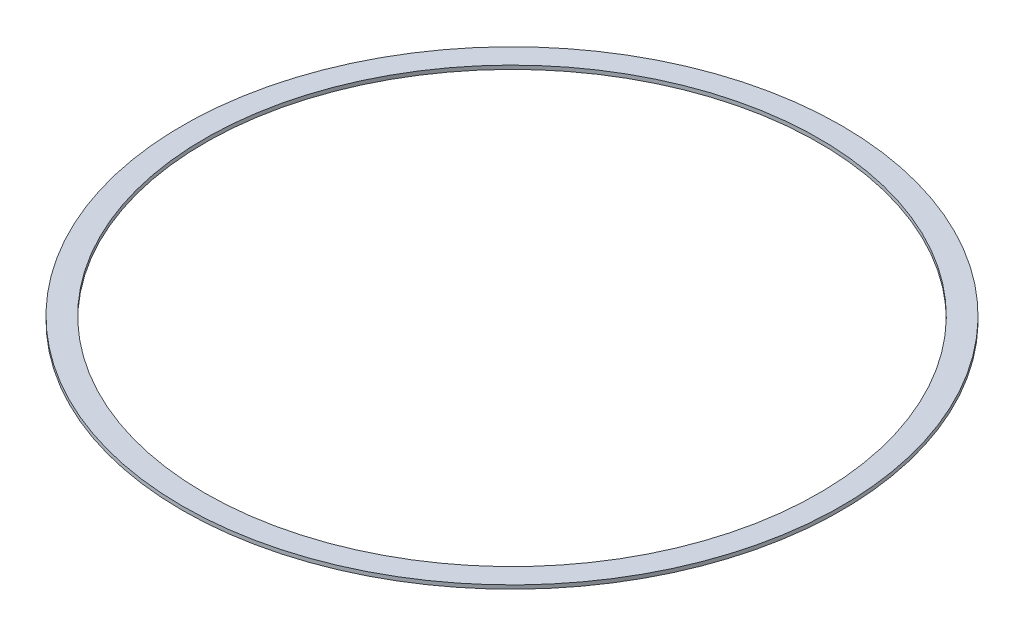
ISO-10303-21;
HEADER;
FILE_DESCRIPTION(('STEP AP214'),'2;1');
FILE_NAME('part.step','',(''),(''),'','','');
FILE_SCHEMA(('AUTOMOTIVE_DESIGN { 1 0 10303 214 1 1 1 1 }'));
ENDSEC;
DATA;
#1=APPLICATION_CONTEXT('core data for automotive mechanical design processes');
#2=APPLICATION_PROTOCOL_DEFINITION('international standard','automotive_design',2000,#1);
#3=PRODUCT_CONTEXT('',#1,'mechanical');
#4=PRODUCT('Part','Part','',(#3));
#5=PRODUCT_RELATED_PRODUCT_CATEGORY('part','',(#4));
#6=PRODUCT_DEFINITION_FORMATION('','',#4);
#7=PRODUCT_DEFINITION_CONTEXT('part definition',#1,'design');
#8=PRODUCT_DEFINITION('design','',#6,#7);
#9=PRODUCT_DEFINITION_SHAPE('','',#8);
#10=(LENGTH_UNIT() NAMED_UNIT(*) SI_UNIT(.MILLI.,.METRE.));
#11=(NAMED_UNIT(*) PLANE_ANGLE_UNIT() SI_UNIT($,.RADIAN.));
#12=(NAMED_UNIT(*) SI_UNIT($,.STERADIAN.) SOLID_ANGLE_UNIT());
#13=UNCERTAINTY_MEASURE_WITH_UNIT(LENGTH_MEASURE(1.E-05),#10,'distance_accuracy_value','');
#14=(GEOMETRIC_REPRESENTATION_CONTEXT(3) GLOBAL_UNCERTAINTY_ASSIGNED_CONTEXT((#13)) GLOBAL_UNIT_ASSIGNED_CONTEXT((#10,
#11,#12)) REPRESENTATION_CONTEXT('',''));
#15=CARTESIAN_POINT('',(0.,0.,0.));
#16=DIRECTION('',(0.,0.,1.));
#17=DIRECTION('',(1.,0.,0.));
#18=AXIS2_PLACEMENT_3D('',#15,#16,#17);
#19=CARTESIAN_POINT('',(0.,2.54,0.));
#20=DIRECTION('',(0.,1.,0.));
#21=DIRECTION('',(0.,0.,1.));
#22=AXIS2_PLACEMENT_3D('',#19,#20,#21);
#23=PLANE('',#22);
#24=CARTESIAN_POINT('',(0.,2.54,0.));
#25=DIRECTION('',(0.,1.,0.));
#26=DIRECTION('',(0.,0.,1.));
#27=AXIS2_PLACEMENT_3D('',#24,#25,#26);
#28=CIRCLE('',#27,223.8248);
#29=CARTESIAN_POINT('',(0.,2.54,223.8248));
#30=VERTEX_POINT('',#29);
#31=EDGE_CURVE('E10',#30,#30,#28,.T.);
#32=ORIENTED_EDGE('',*,*,#31,.T.);
#33=EDGE_LOOP('',(#32));
#34=FACE_BOUND('',#33,.T.);
#35=CARTESIAN_POINT('',(0.,2.54,0.));
#36=DIRECTION('',(0.,1.,0.));
#37=DIRECTION('',(0.,0.,1.));
#38=AXIS2_PLACEMENT_3D('',#35,#36,#37);
#39=CIRCLE('',#38,208.5848);
#40=CARTESIAN_POINT('',(0.,2.54,208.5848));
#41=VERTEX_POINT('',#40);
#42=EDGE_CURVE('E57',#41,#41,#39,.T.);
#43=ORIENTED_EDGE('',*,*,#42,.F.);
#44=EDGE_LOOP('',(#43));
#45=FACE_BOUND('',#44,.T.);
#46=ADVANCED_FACE('F44',(#34,#45),#23,.T.);
#47=CARTESIAN_POINT('',(0.,0.,0.));
#48=DIRECTION('',(0.,1.,0.));
#49=DIRECTION('',(0.,0.,1.));
#50=AXIS2_PLACEMENT_3D('',#47,#48,#49);
#51=PLANE('',#50);
#52=CARTESIAN_POINT('',(0.,0.,0.));
#53=DIRECTION('',(0.,1.,0.));
#54=DIRECTION('',(0.,0.,1.));
#55=AXIS2_PLACEMENT_3D('',#52,#53,#54);
#56=CIRCLE('',#55,223.8248);
#57=CARTESIAN_POINT('',(0.,0.,223.8248));
#58=VERTEX_POINT('',#57);
#59=EDGE_CURVE('E48',#58,#58,#56,.T.);
#60=ORIENTED_EDGE('',*,*,#59,.F.);
#61=EDGE_LOOP('',(#60));
#62=FACE_BOUND('',#61,.T.);
#63=CARTESIAN_POINT('',(0.,0.,0.));
#64=DIRECTION('',(0.,1.,0.));
#65=DIRECTION('',(0.,0.,1.));
#66=AXIS2_PLACEMENT_3D('',#63,#64,#65);
#67=CIRCLE('',#66,208.5848);
#68=CARTESIAN_POINT('',(0.,0.,208.5848));
#69=VERTEX_POINT('',#68);
#70=EDGE_CURVE('E59',#69,#69,#67,.T.);
#71=ORIENTED_EDGE('',*,*,#70,.T.);
#72=EDGE_LOOP('',(#71));
#73=FACE_BOUND('',#72,.T.);
#74=ADVANCED_FACE('F71',(#62,#73),#51,.F.);
#75=CARTESIAN_POINT('',(0.,2.54,0.));
#76=DIRECTION('',(0.,-1.,0.));
#77=DIRECTION('',(0.,0.,-1.));
#78=AXIS2_PLACEMENT_3D('',#75,#76,#77);
#79=CYLINDRICAL_SURFACE('',#78,223.8248);
#80=ORIENTED_EDGE('',*,*,#31,.F.);
#81=EDGE_LOOP('',(#80));
#82=FACE_BOUND('',#81,.T.);
#83=ORIENTED_EDGE('',*,*,#59,.T.);
#84=EDGE_LOOP('',(#83));
#85=FACE_BOUND('',#84,.T.);
#86=ADVANCED_FACE('F46',(#82,#85),#79,.T.);
#87=CARTESIAN_POINT('',(0.,2.54,0.));
#88=DIRECTION('',(0.,-1.,0.));
#89=DIRECTION('',(0.,0.,-1.));
#90=AXIS2_PLACEMENT_3D('',#87,#88,#89);
#91=CYLINDRICAL_SURFACE('',#90,208.5848);
#92=ORIENTED_EDGE('',*,*,#42,.T.);
#93=EDGE_LOOP('',(#92));
#94=FACE_BOUND('',#93,.T.);
#95=ORIENTED_EDGE('',*,*,#70,.F.);
#96=EDGE_LOOP('',(#95));
#97=FACE_BOUND('',#96,.T.);
#98=ADVANCED_FACE('F67',(#94,#97),#91,.F.);
#99=CLOSED_SHELL('',(#46,#74,#86,#98));
#100=MANIFOLD_SOLID_BREP('B2',#99);
#101=ADVANCED_BREP_SHAPE_REPRESENTATION('',(#18,#100),#14);
#102=SHAPE_DEFINITION_REPRESENTATION(#9,#101);
ENDSEC;
END-ISO-10303-21;
